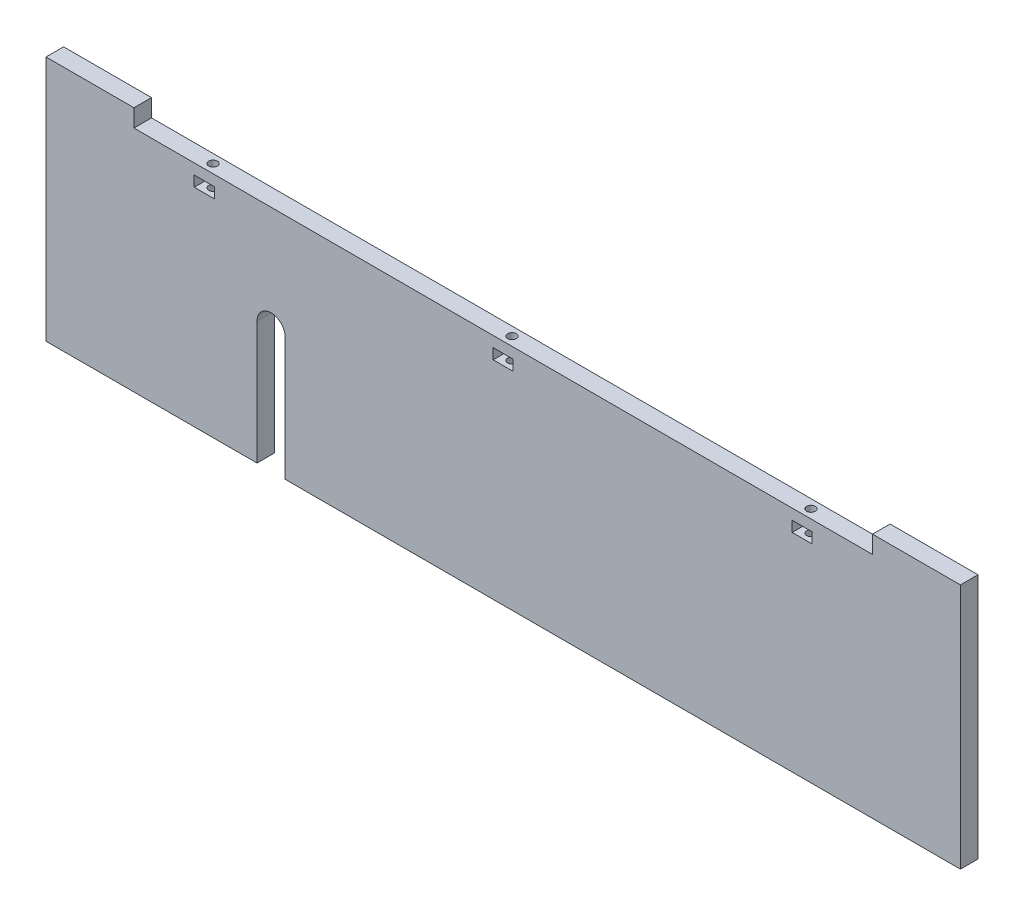
ISO-10303-21;
HEADER;
FILE_DESCRIPTION(('STEP AP214'),'2;1');
FILE_NAME('part.step','',(''),(''),'','','');
FILE_SCHEMA(('AUTOMOTIVE_DESIGN { 1 0 10303 214 1 1 1 1 }'));
ENDSEC;
DATA;
#1=APPLICATION_CONTEXT('core data for automotive mechanical design processes');
#2=APPLICATION_PROTOCOL_DEFINITION('international standard','automotive_design',2000,#1);
#3=PRODUCT_CONTEXT('',#1,'mechanical');
#4=PRODUCT('Part','Part','',(#3));
#5=PRODUCT_RELATED_PRODUCT_CATEGORY('part','',(#4));
#6=PRODUCT_DEFINITION_FORMATION('','',#4);
#7=PRODUCT_DEFINITION_CONTEXT('part definition',#1,'design');
#8=PRODUCT_DEFINITION('design','',#6,#7);
#9=PRODUCT_DEFINITION_SHAPE('','',#8);
#10=(LENGTH_UNIT() NAMED_UNIT(*) SI_UNIT(.MILLI.,.METRE.));
#11=(NAMED_UNIT(*) PLANE_ANGLE_UNIT() SI_UNIT($,.RADIAN.));
#12=(NAMED_UNIT(*) SI_UNIT($,.STERADIAN.) SOLID_ANGLE_UNIT());
#13=UNCERTAINTY_MEASURE_WITH_UNIT(LENGTH_MEASURE(1.E-05),#10,'distance_accuracy_value','');
#14=(GEOMETRIC_REPRESENTATION_CONTEXT(3) GLOBAL_UNCERTAINTY_ASSIGNED_CONTEXT((#13)) GLOBAL_UNIT_ASSIGNED_CONTEXT((#10,
#11,#12)) REPRESENTATION_CONTEXT('',''));
#15=CARTESIAN_POINT('',(0.,0.,0.));
#16=DIRECTION('',(0.,0.,1.));
#17=DIRECTION('',(1.,0.,0.));
#18=AXIS2_PLACEMENT_3D('',#15,#16,#17);
#19=CARTESIAN_POINT('',(54.9999999999999,1.19904086659517E-13,5.));
#20=DIRECTION('',(-1.,0.,0.));
#21=DIRECTION('',(0.,-1.,0.));
#22=AXIS2_PLACEMENT_3D('',#19,#20,#21);
#23=PLANE('',#22);
#24=DIRECTION('',(0.,-1.,0.));
#25=VECTOR('',#24,1.);
#26=CARTESIAN_POINT('',(54.9999999999998,16.9589552238804,0.));
#27=LINE('',#26,#25);
#28=CARTESIAN_POINT('',(54.9999999999996,35.0000000000001,0.));
#29=VERTEX_POINT('',#28);
#30=CARTESIAN_POINT('',(54.9999999999999,1.19904086659517E-13,0.));
#31=VERTEX_POINT('',#30);
#32=EDGE_CURVE('E182',#29,#31,#27,.T.);
#33=ORIENTED_EDGE('',*,*,#32,.F.);
#34=DIRECTION('',(0.,0.,-1.));
#35=VECTOR('',#34,1.);
#36=CARTESIAN_POINT('',(54.9999999999996,35.0000000000001,5.));
#37=LINE('',#36,#35);
#38=CARTESIAN_POINT('',(54.9999999999996,35.0000000000001,5.));
#39=VERTEX_POINT('',#38);
#40=EDGE_CURVE('E25',#39,#29,#37,.T.);
#41=ORIENTED_EDGE('',*,*,#40,.F.);
#42=DIRECTION('',(0.,1.,0.));
#43=VECTOR('',#42,1.);
#44=CARTESIAN_POINT('',(54.9999999999998,16.9589552238804,5.));
#45=LINE('',#44,#43);
#46=CARTESIAN_POINT('',(54.9999999999999,1.19904086659517E-13,5.));
#47=VERTEX_POINT('',#46);
#48=EDGE_CURVE('E210',#47,#39,#45,.T.);
#49=ORIENTED_EDGE('',*,*,#48,.F.);
#50=DIRECTION('',(0.,0.,1.));
#51=VECTOR('',#50,1.);
#52=CARTESIAN_POINT('',(54.9999999999999,1.06759475858222E-13,2.5));
#53=LINE('',#52,#51);
#54=EDGE_CURVE('E186',#31,#47,#53,.T.);
#55=ORIENTED_EDGE('',*,*,#54,.F.);
#56=EDGE_LOOP('',(#33,#41,#49,#55));
#57=FACE_BOUND('',#56,.T.);
#58=ADVANCED_FACE('F16',(#57),#23,.F.);
#59=CARTESIAN_POINT('',(62.9999999999996,34.9999999999996,5.));
#60=DIRECTION('',(1.,0.,0.));
#61=DIRECTION('',(0.,1.,0.));
#62=AXIS2_PLACEMENT_3D('',#59,#60,#61);
#63=PLANE('',#62);
#64=DIRECTION('',(0.,1.,0.));
#65=VECTOR('',#64,1.);
#66=CARTESIAN_POINT('',(62.9999999999996,34.4589552238802,0.));
#67=LINE('',#66,#65);
#68=CARTESIAN_POINT('',(62.9999999999999,1.29368869832E-13,0.));
#69=VERTEX_POINT('',#68);
#70=CARTESIAN_POINT('',(62.9999999999996,34.9999999999996,0.));
#71=VERTEX_POINT('',#70);
#72=EDGE_CURVE('E203',#69,#71,#67,.T.);
#73=ORIENTED_EDGE('',*,*,#72,.F.);
#74=DIRECTION('',(0.,0.,-1.));
#75=VECTOR('',#74,1.);
#76=CARTESIAN_POINT('',(62.9999999999999,1.17683640610267E-13,2.5));
#77=LINE('',#76,#75);
#78=CARTESIAN_POINT('',(62.9999999999999,1.29368869832E-13,5.));
#79=VERTEX_POINT('',#78);
#80=EDGE_CURVE('E223',#79,#69,#77,.T.);
#81=ORIENTED_EDGE('',*,*,#80,.F.);
#82=DIRECTION('',(0.,-1.,0.));
#83=VECTOR('',#82,1.);
#84=CARTESIAN_POINT('',(62.9999999999996,34.4589552238802,5.));
#85=LINE('',#84,#83);
#86=CARTESIAN_POINT('',(62.9999999999996,34.9999999999996,5.));
#87=VERTEX_POINT('',#86);
#88=EDGE_CURVE('E231',#87,#79,#85,.T.);
#89=ORIENTED_EDGE('',*,*,#88,.F.);
#90=DIRECTION('',(0.,0.,-1.));
#91=VECTOR('',#90,1.);
#92=CARTESIAN_POINT('',(62.9999999999996,34.9999999999996,5.));
#93=LINE('',#92,#91);
#94=EDGE_CURVE('E11',#87,#71,#93,.T.);
#95=ORIENTED_EDGE('',*,*,#94,.T.);
#96=EDGE_LOOP('',(#73,#81,#89,#95));
#97=FACE_BOUND('',#96,.T.);
#98=ADVANCED_FACE('F456',(#97),#63,.F.);
#99=CARTESIAN_POINT('',(58.9999999999996,34.9999999999996,5.));
#100=DIRECTION('',(0.,0.,-1.));
#101=DIRECTION('',(0.,-1.,0.));
#102=AXIS2_PLACEMENT_3D('',#99,#100,#101);
#103=CYLINDRICAL_SURFACE('',#102,4.);
#104=CARTESIAN_POINT('',(58.9999999999996,34.9999999999996,0.));
#105=DIRECTION('',(0.,0.,1.));
#106=DIRECTION('',(1.,0.,0.));
#107=AXIS2_PLACEMENT_3D('',#104,#105,#106);
#108=CIRCLE('',#107,4.);
#109=EDGE_CURVE('E191',#71,#29,#108,.T.);
#110=ORIENTED_EDGE('',*,*,#109,.F.);
#111=ORIENTED_EDGE('',*,*,#94,.F.);
#112=CARTESIAN_POINT('',(58.9999999999996,34.9999999999996,5.));
#113=DIRECTION('',(0.,0.,-1.));
#114=DIRECTION('',(0.,-1.,0.));
#115=AXIS2_PLACEMENT_3D('',#112,#113,#114);
#116=CIRCLE('',#115,4.);
#117=EDGE_CURVE('E198',#39,#87,#116,.T.);
#118=ORIENTED_EDGE('',*,*,#117,.F.);
#119=ORIENTED_EDGE('',*,*,#40,.T.);
#120=EDGE_LOOP('',(#110,#111,#118,#119));
#121=FACE_BOUND('',#120,.T.);
#122=ADVANCED_FACE('F18',(#121),#103,.F.);
#123=CARTESIAN_POINT('',(-4.99999999999996,0.,0.));
#124=DIRECTION('',(0.,-1.,0.));
#125=DIRECTION('',(1.,0.,0.));
#126=AXIS2_PLACEMENT_3D('',#123,#124,#125);
#127=PLANE('',#126);
#128=ORIENTED_EDGE('',*,*,#54,.T.);
#129=DIRECTION('',(1.,0.,0.));
#130=VECTOR('',#129,1.);
#131=CARTESIAN_POINT('',(-4.99999999999996,0.,5.));
#132=LINE('',#131,#130);
#133=CARTESIAN_POINT('',(-4.99999999999996,0.,5.));
#134=VERTEX_POINT('',#133);
#135=EDGE_CURVE('E212',#134,#47,#132,.T.);
#136=ORIENTED_EDGE('',*,*,#135,.F.);
#137=DIRECTION('',(0.,0.,1.));
#138=VECTOR('',#137,1.);
#139=CARTESIAN_POINT('',(-4.99999999999996,0.,0.));
#140=LINE('',#139,#138);
#141=CARTESIAN_POINT('',(-4.99999999999996,0.,0.));
#142=VERTEX_POINT('',#141);
#143=EDGE_CURVE('E216',#142,#134,#140,.T.);
#144=ORIENTED_EDGE('',*,*,#143,.F.);
#145=DIRECTION('',(1.,0.,0.));
#146=VECTOR('',#145,1.);
#147=CARTESIAN_POINT('',(-4.99999999999996,0.,0.));
#148=LINE('',#147,#146);
#149=EDGE_CURVE('E221',#142,#31,#148,.T.);
#150=ORIENTED_EDGE('',*,*,#149,.T.);
#151=EDGE_LOOP('',(#128,#136,#144,#150));
#152=FACE_BOUND('',#151,.T.);
#153=ADVANCED_FACE('F426',(#152),#127,.T.);
#154=CARTESIAN_POINT('',(-4.99999999999996,0.,0.));
#155=DIRECTION('',(0.,-1.,0.));
#156=DIRECTION('',(1.,0.,0.));
#157=AXIS2_PLACEMENT_3D('',#154,#155,#156);
#158=PLANE('',#157);
#159=ORIENTED_EDGE('',*,*,#80,.T.);
#160=DIRECTION('',(1.,0.,0.));
#161=VECTOR('',#160,1.);
#162=CARTESIAN_POINT('',(-4.99999999999996,0.,0.));
#163=LINE('',#162,#161);
#164=CARTESIAN_POINT('',(255.,3.72541736806596E-13,0.));
#165=VERTEX_POINT('',#164);
#166=EDGE_CURVE('E224',#69,#165,#163,.T.);
#167=ORIENTED_EDGE('',*,*,#166,.T.);
#168=DIRECTION('',(0.,0.,1.));
#169=VECTOR('',#168,1.);
#170=CARTESIAN_POINT('',(255.,3.72541736806596E-13,0.));
#171=LINE('',#170,#169);
#172=CARTESIAN_POINT('',(255.,3.72541736806596E-13,5.));
#173=VERTEX_POINT('',#172);
#174=EDGE_CURVE('E205',#165,#173,#171,.T.);
#175=ORIENTED_EDGE('',*,*,#174,.T.);
#176=DIRECTION('',(1.,0.,0.));
#177=VECTOR('',#176,1.);
#178=CARTESIAN_POINT('',(-4.99999999999996,0.,5.));
#179=LINE('',#178,#177);
#180=EDGE_CURVE('E229',#79,#173,#179,.T.);
#181=ORIENTED_EDGE('',*,*,#180,.F.);
#182=EDGE_LOOP('',(#159,#167,#175,#181));
#183=FACE_BOUND('',#182,.T.);
#184=ADVANCED_FACE('F454',(#183),#158,.T.);
#185=CARTESIAN_POINT('',(125.,33.9179104477613,0.));
#186=DIRECTION('',(0.,0.,1.));
#187=DIRECTION('',(0.,-1.,0.));
#188=AXIS2_PLACEMENT_3D('',#185,#186,#187);
#189=PLANE('',#188);
#190=ORIENTED_EDGE('',*,*,#72,.T.);
#191=ORIENTED_EDGE('',*,*,#109,.T.);
#192=ORIENTED_EDGE('',*,*,#32,.T.);
#193=ORIENTED_EDGE('',*,*,#149,.F.);
#194=DIRECTION('',(0.,-1.,0.));
#195=VECTOR('',#194,1.);
#196=CARTESIAN_POINT('',(-5.00000000000005,69.9999999999997,0.));
#197=LINE('',#196,#195);
#198=CARTESIAN_POINT('',(-5.00000000000005,69.9999999999997,0.));
#199=VERTEX_POINT('',#198);
#200=EDGE_CURVE('E219',#199,#142,#197,.T.);
#201=ORIENTED_EDGE('',*,*,#200,.F.);
#202=DIRECTION('',(-1.,0.,0.));
#203=VECTOR('',#202,1.);
#204=CARTESIAN_POINT('',(20.,69.9999999999997,0.));
#205=LINE('',#204,#203);
#206=CARTESIAN_POINT('',(20.,69.9999999999997,0.));
#207=VERTEX_POINT('',#206);
#208=EDGE_CURVE('E220',#207,#199,#205,.T.);
#209=ORIENTED_EDGE('',*,*,#208,.F.);
#210=DIRECTION('',(0.,1.,0.));
#211=VECTOR('',#210,1.);
#212=CARTESIAN_POINT('',(20.,64.9999999999998,0.));
#213=LINE('',#212,#211);
#214=CARTESIAN_POINT('',(20.,64.9999999999998,0.));
#215=VERTEX_POINT('',#214);
#216=EDGE_CURVE('E237',#215,#207,#213,.T.);
#217=ORIENTED_EDGE('',*,*,#216,.F.);
#218=DIRECTION('',(-1.,0.,0.));
#219=VECTOR('',#218,1.);
#220=CARTESIAN_POINT('',(230.,65.0000000000001,0.));
#221=LINE('',#220,#219);
#222=CARTESIAN_POINT('',(230.,65.0000000000001,0.));
#223=VERTEX_POINT('',#222);
#224=EDGE_CURVE('E240',#223,#215,#221,.T.);
#225=ORIENTED_EDGE('',*,*,#224,.F.);
#226=DIRECTION('',(0.,-1.,0.));
#227=VECTOR('',#226,1.);
#228=CARTESIAN_POINT('',(230.,70.0000000000001,0.));
#229=LINE('',#228,#227);
#230=CARTESIAN_POINT('',(230.,70.0000000000001,0.));
#231=VERTEX_POINT('',#230);
#232=EDGE_CURVE('E244',#231,#223,#229,.T.);
#233=ORIENTED_EDGE('',*,*,#232,.F.);
#234=DIRECTION('',(-1.,0.,0.));
#235=VECTOR('',#234,1.);
#236=CARTESIAN_POINT('',(255.,70.0000000000002,0.));
#237=LINE('',#236,#235);
#238=CARTESIAN_POINT('',(255.,70.0000000000002,0.));
#239=VERTEX_POINT('',#238);
#240=EDGE_CURVE('E247',#239,#231,#237,.T.);
#241=ORIENTED_EDGE('',*,*,#240,.F.);
#242=DIRECTION('',(0.,1.,0.));
#243=VECTOR('',#242,1.);
#244=CARTESIAN_POINT('',(255.,3.72541736806596E-13,0.));
#245=LINE('',#244,#243);
#246=EDGE_CURVE('E250',#165,#239,#245,.T.);
#247=ORIENTED_EDGE('',*,*,#246,.F.);
#248=ORIENTED_EDGE('',*,*,#166,.F.);
#249=EDGE_LOOP('',(#190,#191,#192,#193,#201,#209,#217,#225,#233,#241,#247,#248));
#250=FACE_BOUND('',#249,.T.);
#251=DIRECTION('',(0.,-1.,0.));
#252=VECTOR('',#251,1.);
#253=CARTESIAN_POINT('',(207.15,46.4589552238807,0.));
#254=LINE('',#253,#252);
#255=CARTESIAN_POINT('',(207.15,62.0000000000001,0.));
#256=VERTEX_POINT('',#255);
#257=CARTESIAN_POINT('',(207.15,59.0000000000001,0.));
#258=VERTEX_POINT('',#257);
#259=EDGE_CURVE('E192',#256,#258,#254,.T.);
#260=ORIENTED_EDGE('',*,*,#259,.T.);
#261=DIRECTION('',(1.,0.,0.));
#262=VECTOR('',#261,1.);
#263=CARTESIAN_POINT('',(168.925,59.,0.));
#264=LINE('',#263,#262);
#265=CARTESIAN_POINT('',(212.85,59.0000000000001,0.));
#266=VERTEX_POINT('',#265);
#267=EDGE_CURVE('E255',#258,#266,#264,.T.);
#268=ORIENTED_EDGE('',*,*,#267,.T.);
#269=DIRECTION('',(0.,1.,0.));
#270=VECTOR('',#269,1.);
#271=CARTESIAN_POINT('',(212.85,47.9589552238807,0.));
#272=LINE('',#271,#270);
#273=CARTESIAN_POINT('',(212.85,62.0000000000001,0.));
#274=VERTEX_POINT('',#273);
#275=EDGE_CURVE('E258',#266,#274,#272,.T.);
#276=ORIENTED_EDGE('',*,*,#275,.T.);
#277=DIRECTION('',(-1.,0.,0.));
#278=VECTOR('',#277,1.);
#279=CARTESIAN_POINT('',(166.075,62.,0.));
#280=LINE('',#279,#278);
#281=EDGE_CURVE('E261',#274,#256,#280,.T.);
#282=ORIENTED_EDGE('',*,*,#281,.T.);
#283=EDGE_LOOP('',(#260,#268,#276,#282));
#284=FACE_BOUND('',#283,.T.);
#285=DIRECTION('',(0.,-1.,0.));
#286=VECTOR('',#285,1.);
#287=CARTESIAN_POINT('',(37.15,46.4589552238805,0.));
#288=LINE('',#287,#286);
#289=CARTESIAN_POINT('',(37.15,61.9999999999998,0.));
#290=VERTEX_POINT('',#289);
#291=CARTESIAN_POINT('',(37.15,58.9999999999998,0.));
#292=VERTEX_POINT('',#291);
#293=EDGE_CURVE('E263',#290,#292,#288,.T.);
#294=ORIENTED_EDGE('',*,*,#293,.T.);
#295=DIRECTION('',(1.,0.,0.));
#296=VECTOR('',#295,1.);
#297=CARTESIAN_POINT('',(83.925,58.9999999999999,0.));
#298=LINE('',#297,#296);
#299=CARTESIAN_POINT('',(42.85,58.9999999999998,0.));
#300=VERTEX_POINT('',#299);
#301=EDGE_CURVE('E266',#292,#300,#298,.T.);
#302=ORIENTED_EDGE('',*,*,#301,.T.);
#303=DIRECTION('',(0.,1.,0.));
#304=VECTOR('',#303,1.);
#305=CARTESIAN_POINT('',(42.85,47.9589552238805,0.));
#306=LINE('',#305,#304);
#307=CARTESIAN_POINT('',(42.85,61.9999999999998,0.));
#308=VERTEX_POINT('',#307);
#309=EDGE_CURVE('E269',#300,#308,#306,.T.);
#310=ORIENTED_EDGE('',*,*,#309,.T.);
#311=DIRECTION('',(-1.,0.,0.));
#312=VECTOR('',#311,1.);
#313=CARTESIAN_POINT('',(81.075,61.9999999999998,0.));
#314=LINE('',#313,#312);
#315=EDGE_CURVE('E272',#308,#290,#314,.T.);
#316=ORIENTED_EDGE('',*,*,#315,.T.);
#317=EDGE_LOOP('',(#294,#302,#310,#316));
#318=FACE_BOUND('',#317,.T.);
#319=DIRECTION('',(-1.,0.,0.));
#320=VECTOR('',#319,1.);
#321=CARTESIAN_POINT('',(123.575,61.9999999999999,0.));
#322=LINE('',#321,#320);
#323=CARTESIAN_POINT('',(127.85,61.9999999999999,0.));
#324=VERTEX_POINT('',#323);
#325=CARTESIAN_POINT('',(122.15,61.9999999999999,0.));
#326=VERTEX_POINT('',#325);
#327=EDGE_CURVE('E274',#324,#326,#322,.T.);
#328=ORIENTED_EDGE('',*,*,#327,.T.);
#329=DIRECTION('',(0.,-1.,0.));
#330=VECTOR('',#329,1.);
#331=CARTESIAN_POINT('',(122.15,46.4589552238806,0.));
#332=LINE('',#331,#330);
#333=CARTESIAN_POINT('',(122.15,59.,0.));
#334=VERTEX_POINT('',#333);
#335=EDGE_CURVE('E277',#326,#334,#332,.T.);
#336=ORIENTED_EDGE('',*,*,#335,.T.);
#337=DIRECTION('',(1.,0.,0.));
#338=VECTOR('',#337,1.);
#339=CARTESIAN_POINT('',(126.425,59.,0.));
#340=LINE('',#339,#338);
#341=CARTESIAN_POINT('',(127.85,59.,0.));
#342=VERTEX_POINT('',#341);
#343=EDGE_CURVE('E280',#334,#342,#340,.T.);
#344=ORIENTED_EDGE('',*,*,#343,.T.);
#345=DIRECTION('',(0.,1.,0.));
#346=VECTOR('',#345,1.);
#347=CARTESIAN_POINT('',(127.85,47.9589552238806,0.));
#348=LINE('',#347,#346);
#349=EDGE_CURVE('E283',#342,#324,#348,.T.);
#350=ORIENTED_EDGE('',*,*,#349,.T.);
#351=EDGE_LOOP('',(#328,#336,#344,#350));
#352=FACE_BOUND('',#351,.T.);
#353=ADVANCED_FACE('F200',(#250,#284,#318,#352),#189,.F.);
#354=CARTESIAN_POINT('',(127.85,61.9999999999999,5.));
#355=DIRECTION('',(1.,0.,0.));
#356=DIRECTION('',(0.,1.,0.));
#357=AXIS2_PLACEMENT_3D('',#354,#355,#356);
#358=PLANE('',#357);
#359=ORIENTED_EDGE('',*,*,#349,.F.);
#360=DIRECTION('',(0.,0.,-1.));
#361=VECTOR('',#360,1.);
#362=CARTESIAN_POINT('',(127.85,59.,5.));
#363=LINE('',#362,#361);
#364=CARTESIAN_POINT('',(127.85,59.,5.));
#365=VERTEX_POINT('',#364);
#366=EDGE_CURVE('E286',#365,#342,#363,.T.);
#367=ORIENTED_EDGE('',*,*,#366,.F.);
#368=DIRECTION('',(0.,-1.,0.));
#369=VECTOR('',#368,1.);
#370=CARTESIAN_POINT('',(127.85,47.9589552238806,5.));
#371=LINE('',#370,#369);
#372=CARTESIAN_POINT('',(127.85,61.9999999999999,5.));
#373=VERTEX_POINT('',#372);
#374=EDGE_CURVE('E290',#373,#365,#371,.T.);
#375=ORIENTED_EDGE('',*,*,#374,.F.);
#376=DIRECTION('',(0.,0.,-1.));
#377=VECTOR('',#376,1.);
#378=CARTESIAN_POINT('',(127.85,61.9999999999999,5.));
#379=LINE('',#378,#377);
#380=EDGE_CURVE('E285',#373,#324,#379,.T.);
#381=ORIENTED_EDGE('',*,*,#380,.T.);
#382=EDGE_LOOP('',(#359,#367,#375,#381));
#383=FACE_BOUND('',#382,.T.);
#384=ADVANCED_FACE('F472',(#383),#358,.F.);
#385=CARTESIAN_POINT('',(127.85,59.,5.));
#386=DIRECTION('',(0.,-1.,0.));
#387=DIRECTION('',(1.,0.,0.));
#388=AXIS2_PLACEMENT_3D('',#385,#386,#387);
#389=PLANE('',#388);
#390=ORIENTED_EDGE('',*,*,#343,.F.);
#391=DIRECTION('',(0.,0.,-1.));
#392=VECTOR('',#391,1.);
#393=CARTESIAN_POINT('',(122.15,59.,5.));
#394=LINE('',#393,#392);
#395=CARTESIAN_POINT('',(122.15,59.,5.));
#396=VERTEX_POINT('',#395);
#397=EDGE_CURVE('E295',#396,#334,#394,.T.);
#398=ORIENTED_EDGE('',*,*,#397,.F.);
#399=DIRECTION('',(-1.,0.,0.));
#400=VECTOR('',#399,1.);
#401=CARTESIAN_POINT('',(126.425,59.,5.));
#402=LINE('',#401,#400);
#403=EDGE_CURVE('E292',#365,#396,#402,.T.);
#404=ORIENTED_EDGE('',*,*,#403,.F.);
#405=ORIENTED_EDGE('',*,*,#366,.T.);
#406=EDGE_LOOP('',(#390,#398,#404,#405));
#407=FACE_BOUND('',#406,.T.);
#408=CARTESIAN_POINT('',(125.,58.9999999999999,2.5));
#409=DIRECTION('',(0.,1.,0.));
#410=DIRECTION('',(1.,0.,0.));
#411=AXIS2_PLACEMENT_3D('',#408,#409,#410);
#412=CIRCLE('',#411,1.2295);
#413=CARTESIAN_POINT('',(126.2295,58.9999999999999,2.5));
#414=VERTEX_POINT('',#413);
#415=EDGE_CURVE('E301',#414,#414,#412,.T.);
#416=ORIENTED_EDGE('',*,*,#415,.F.);
#417=EDGE_LOOP('',(#416));
#418=FACE_BOUND('',#417,.T.);
#419=ADVANCED_FACE('F475',(#407,#418),#389,.F.);
#420=CARTESIAN_POINT('',(122.15,61.9999999999999,5.));
#421=DIRECTION('',(0.,1.,0.));
#422=DIRECTION('',(-1.,0.,0.));
#423=AXIS2_PLACEMENT_3D('',#420,#421,#422);
#424=PLANE('',#423);
#425=ORIENTED_EDGE('',*,*,#327,.F.);
#426=ORIENTED_EDGE('',*,*,#380,.F.);
#427=DIRECTION('',(1.,0.,0.));
#428=VECTOR('',#427,1.);
#429=CARTESIAN_POINT('',(123.575,61.9999999999999,5.));
#430=LINE('',#429,#428);
#431=CARTESIAN_POINT('',(122.15,61.9999999999999,5.));
#432=VERTEX_POINT('',#431);
#433=EDGE_CURVE('E211',#432,#373,#430,.T.);
#434=ORIENTED_EDGE('',*,*,#433,.F.);
#435=DIRECTION('',(0.,0.,-1.));
#436=VECTOR('',#435,1.);
#437=CARTESIAN_POINT('',(122.15,61.9999999999999,5.));
#438=LINE('',#437,#436);
#439=EDGE_CURVE('E289',#432,#326,#438,.T.);
#440=ORIENTED_EDGE('',*,*,#439,.T.);
#441=EDGE_LOOP('',(#425,#426,#434,#440));
#442=FACE_BOUND('',#441,.T.);
#443=CARTESIAN_POINT('',(125.,62.,2.5));
#444=DIRECTION('',(0.,-1.,0.));
#445=DIRECTION('',(0.,0.,-1.));
#446=AXIS2_PLACEMENT_3D('',#443,#444,#445);
#447=CIRCLE('',#446,1.2295);
#448=CARTESIAN_POINT('',(125.,62.,1.2705));
#449=VERTEX_POINT('',#448);
#450=EDGE_CURVE('E310',#449,#449,#447,.T.);
#451=ORIENTED_EDGE('',*,*,#450,.F.);
#452=EDGE_LOOP('',(#451));
#453=FACE_BOUND('',#452,.T.);
#454=ADVANCED_FACE('F479',(#442,#453),#424,.F.);
#455=CARTESIAN_POINT('',(122.15,59.,5.));
#456=DIRECTION('',(-1.,0.,0.));
#457=DIRECTION('',(0.,-1.,0.));
#458=AXIS2_PLACEMENT_3D('',#455,#456,#457);
#459=PLANE('',#458);
#460=ORIENTED_EDGE('',*,*,#335,.F.);
#461=ORIENTED_EDGE('',*,*,#439,.F.);
#462=DIRECTION('',(0.,1.,0.));
#463=VECTOR('',#462,1.);
#464=CARTESIAN_POINT('',(122.15,46.4589552238806,5.));
#465=LINE('',#464,#463);
#466=EDGE_CURVE('E300',#396,#432,#465,.T.);
#467=ORIENTED_EDGE('',*,*,#466,.F.);
#468=ORIENTED_EDGE('',*,*,#397,.T.);
#469=EDGE_LOOP('',(#460,#461,#467,#468));
#470=FACE_BOUND('',#469,.T.);
#471=ADVANCED_FACE('F483',(#470),#459,.F.);
#472=CARTESIAN_POINT('',(42.85,61.9999999999998,5.));
#473=DIRECTION('',(1.,0.,0.));
#474=DIRECTION('',(0.,1.,0.));
#475=AXIS2_PLACEMENT_3D('',#472,#473,#474);
#476=PLANE('',#475);
#477=ORIENTED_EDGE('',*,*,#309,.F.);
#478=DIRECTION('',(0.,0.,-1.));
#479=VECTOR('',#478,1.);
#480=CARTESIAN_POINT('',(42.85,58.9999999999998,5.));
#481=LINE('',#480,#479);
#482=CARTESIAN_POINT('',(42.85,58.9999999999998,5.));
#483=VERTEX_POINT('',#482);
#484=EDGE_CURVE('E318',#483,#300,#481,.T.);
#485=ORIENTED_EDGE('',*,*,#484,.F.);
#486=DIRECTION('',(0.,-1.,0.));
#487=VECTOR('',#486,1.);
#488=CARTESIAN_POINT('',(42.85,47.9589552238805,5.));
#489=LINE('',#488,#487);
#490=CARTESIAN_POINT('',(42.85,61.9999999999998,5.));
#491=VERTEX_POINT('',#490);
#492=EDGE_CURVE('E323',#491,#483,#489,.T.);
#493=ORIENTED_EDGE('',*,*,#492,.F.);
#494=DIRECTION('',(0.,0.,-1.));
#495=VECTOR('',#494,1.);
#496=CARTESIAN_POINT('',(42.85,61.9999999999998,5.));
#497=LINE('',#496,#495);
#498=EDGE_CURVE('E298',#491,#308,#497,.T.);
#499=ORIENTED_EDGE('',*,*,#498,.T.);
#500=EDGE_LOOP('',(#477,#485,#493,#499));
#501=FACE_BOUND('',#500,.T.);
#502=ADVANCED_FACE('F487',(#501),#476,.F.);
#503=CARTESIAN_POINT('',(37.15,61.9999999999998,5.));
#504=DIRECTION('',(0.,1.,0.));
#505=DIRECTION('',(-1.,0.,0.));
#506=AXIS2_PLACEMENT_3D('',#503,#504,#505);
#507=PLANE('',#506);
#508=ORIENTED_EDGE('',*,*,#315,.F.);
#509=ORIENTED_EDGE('',*,*,#498,.F.);
#510=DIRECTION('',(1.,0.,0.));
#511=VECTOR('',#510,1.);
#512=CARTESIAN_POINT('',(81.075,61.9999999999998,5.));
#513=LINE('',#512,#511);
#514=CARTESIAN_POINT('',(37.15,61.9999999999998,5.));
#515=VERTEX_POINT('',#514);
#516=EDGE_CURVE('E325',#515,#491,#513,.T.);
#517=ORIENTED_EDGE('',*,*,#516,.F.);
#518=DIRECTION('',(0.,0.,-1.));
#519=VECTOR('',#518,1.);
#520=CARTESIAN_POINT('',(37.15,61.9999999999998,5.));
#521=LINE('',#520,#519);
#522=EDGE_CURVE('E329',#515,#290,#521,.T.);
#523=ORIENTED_EDGE('',*,*,#522,.T.);
#524=EDGE_LOOP('',(#508,#509,#517,#523));
#525=FACE_BOUND('',#524,.T.);
#526=CARTESIAN_POINT('',(40.,61.9999999999998,2.5));
#527=DIRECTION('',(0.,-1.,0.));
#528=DIRECTION('',(0.,0.,-1.));
#529=AXIS2_PLACEMENT_3D('',#526,#527,#528);
#530=CIRCLE('',#529,1.2295);
#531=CARTESIAN_POINT('',(40.,61.9999999999998,1.2705));
#532=VERTEX_POINT('',#531);
#533=EDGE_CURVE('E305',#532,#532,#530,.T.);
#534=ORIENTED_EDGE('',*,*,#533,.F.);
#535=EDGE_LOOP('',(#534));
#536=FACE_BOUND('',#535,.T.);
#537=ADVANCED_FACE('F491',(#525,#536),#507,.F.);
#538=CARTESIAN_POINT('',(37.15,58.9999999999998,5.));
#539=DIRECTION('',(-1.,0.,0.));
#540=DIRECTION('',(0.,-1.,0.));
#541=AXIS2_PLACEMENT_3D('',#538,#539,#540);
#542=PLANE('',#541);
#543=ORIENTED_EDGE('',*,*,#293,.F.);
#544=ORIENTED_EDGE('',*,*,#522,.F.);
#545=DIRECTION('',(0.,1.,0.));
#546=VECTOR('',#545,1.);
#547=CARTESIAN_POINT('',(37.15,46.4589552238805,5.));
#548=LINE('',#547,#546);
#549=CARTESIAN_POINT('',(37.15,58.9999999999998,5.));
#550=VERTEX_POINT('',#549);
#551=EDGE_CURVE('E317',#550,#515,#548,.T.);
#552=ORIENTED_EDGE('',*,*,#551,.F.);
#553=DIRECTION('',(0.,0.,-1.));
#554=VECTOR('',#553,1.);
#555=CARTESIAN_POINT('',(37.15,58.9999999999998,5.));
#556=LINE('',#555,#554);
#557=EDGE_CURVE('E321',#550,#292,#556,.T.);
#558=ORIENTED_EDGE('',*,*,#557,.T.);
#559=EDGE_LOOP('',(#543,#544,#552,#558));
#560=FACE_BOUND('',#559,.T.);
#561=ADVANCED_FACE('F495',(#560),#542,.F.);
#562=CARTESIAN_POINT('',(42.85,58.9999999999998,5.));
#563=DIRECTION('',(0.,-1.,0.));
#564=DIRECTION('',(1.,0.,0.));
#565=AXIS2_PLACEMENT_3D('',#562,#563,#564);
#566=PLANE('',#565);
#567=ORIENTED_EDGE('',*,*,#301,.F.);
#568=ORIENTED_EDGE('',*,*,#557,.F.);
#569=DIRECTION('',(-1.,0.,0.));
#570=VECTOR('',#569,1.);
#571=CARTESIAN_POINT('',(83.925,58.9999999999999,5.));
#572=LINE('',#571,#570);
#573=EDGE_CURVE('E326',#483,#550,#572,.T.);
#574=ORIENTED_EDGE('',*,*,#573,.F.);
#575=ORIENTED_EDGE('',*,*,#484,.T.);
#576=EDGE_LOOP('',(#567,#568,#574,#575));
#577=FACE_BOUND('',#576,.T.);
#578=CARTESIAN_POINT('',(40.,58.9999999999998,2.5));
#579=DIRECTION('',(0.,1.,0.));
#580=DIRECTION('',(1.,0.,0.));
#581=AXIS2_PLACEMENT_3D('',#578,#579,#580);
#582=CIRCLE('',#581,1.2295);
#583=CARTESIAN_POINT('',(41.2295,58.9999999999998,2.5));
#584=VERTEX_POINT('',#583);
#585=EDGE_CURVE('E344',#584,#584,#582,.T.);
#586=ORIENTED_EDGE('',*,*,#585,.F.);
#587=EDGE_LOOP('',(#586));
#588=FACE_BOUND('',#587,.T.);
#589=ADVANCED_FACE('F499',(#577,#588),#566,.F.);
#590=CARTESIAN_POINT('',(212.85,62.0000000000001,5.));
#591=DIRECTION('',(1.,0.,0.));
#592=DIRECTION('',(0.,1.,0.));
#593=AXIS2_PLACEMENT_3D('',#590,#591,#592);
#594=PLANE('',#593);
#595=ORIENTED_EDGE('',*,*,#275,.F.);
#596=DIRECTION('',(0.,0.,-1.));
#597=VECTOR('',#596,1.);
#598=CARTESIAN_POINT('',(212.85,59.0000000000001,5.));
#599=LINE('',#598,#597);
#600=CARTESIAN_POINT('',(212.85,59.0000000000001,5.));
#601=VERTEX_POINT('',#600);
#602=EDGE_CURVE('E304',#601,#266,#599,.T.);
#603=ORIENTED_EDGE('',*,*,#602,.F.);
#604=DIRECTION('',(0.,-1.,0.));
#605=VECTOR('',#604,1.);
#606=CARTESIAN_POINT('',(212.85,47.9589552238807,5.));
#607=LINE('',#606,#605);
#608=CARTESIAN_POINT('',(212.85,62.0000000000001,5.));
#609=VERTEX_POINT('',#608);
#610=EDGE_CURVE('E351',#609,#601,#607,.T.);
#611=ORIENTED_EDGE('',*,*,#610,.F.);
#612=DIRECTION('',(0.,0.,-1.));
#613=VECTOR('',#612,1.);
#614=CARTESIAN_POINT('',(212.85,62.0000000000001,5.));
#615=LINE('',#614,#613);
#616=EDGE_CURVE('E322',#609,#274,#615,.T.);
#617=ORIENTED_EDGE('',*,*,#616,.T.);
#618=EDGE_LOOP('',(#595,#603,#611,#617));
#619=FACE_BOUND('',#618,.T.);
#620=ADVANCED_FACE('F503',(#619),#594,.F.);
#621=CARTESIAN_POINT('',(207.15,62.0000000000001,5.));
#622=DIRECTION('',(0.,1.,0.));
#623=DIRECTION('',(-1.,0.,0.));
#624=AXIS2_PLACEMENT_3D('',#621,#622,#623);
#625=PLANE('',#624);
#626=ORIENTED_EDGE('',*,*,#281,.F.);
#627=ORIENTED_EDGE('',*,*,#616,.F.);
#628=DIRECTION('',(1.,0.,0.));
#629=VECTOR('',#628,1.);
#630=CARTESIAN_POINT('',(166.075,62.,5.));
#631=LINE('',#630,#629);
#632=CARTESIAN_POINT('',(207.15,62.0000000000001,5.));
#633=VERTEX_POINT('',#632);
#634=EDGE_CURVE('E353',#633,#609,#631,.T.);
#635=ORIENTED_EDGE('',*,*,#634,.F.);
#636=DIRECTION('',(0.,0.,-1.));
#637=VECTOR('',#636,1.);
#638=CARTESIAN_POINT('',(207.15,62.0000000000001,5.));
#639=LINE('',#638,#637);
#640=EDGE_CURVE('E357',#633,#256,#639,.T.);
#641=ORIENTED_EDGE('',*,*,#640,.T.);
#642=EDGE_LOOP('',(#626,#627,#635,#641));
#643=FACE_BOUND('',#642,.T.);
#644=CARTESIAN_POINT('',(210.,62.0000000000001,2.5));
#645=DIRECTION('',(0.,-1.,0.));
#646=DIRECTION('',(0.,0.,-1.));
#647=AXIS2_PLACEMENT_3D('',#644,#645,#646);
#648=CIRCLE('',#647,1.2295);
#649=CARTESIAN_POINT('',(210.,62.0000000000001,1.2705));
#650=VERTEX_POINT('',#649);
#651=EDGE_CURVE('E336',#650,#650,#648,.T.);
#652=ORIENTED_EDGE('',*,*,#651,.F.);
#653=EDGE_LOOP('',(#652));
#654=FACE_BOUND('',#653,.T.);
#655=ADVANCED_FACE('F507',(#643,#654),#625,.F.);
#656=CARTESIAN_POINT('',(207.15,59.0000000000001,5.));
#657=DIRECTION('',(-1.,0.,0.));
#658=DIRECTION('',(0.,-1.,0.));
#659=AXIS2_PLACEMENT_3D('',#656,#657,#658);
#660=PLANE('',#659);
#661=ORIENTED_EDGE('',*,*,#259,.F.);
#662=ORIENTED_EDGE('',*,*,#640,.F.);
#663=DIRECTION('',(0.,1.,0.));
#664=VECTOR('',#663,1.);
#665=CARTESIAN_POINT('',(207.15,46.4589552238807,5.));
#666=LINE('',#665,#664);
#667=CARTESIAN_POINT('',(207.15,59.0000000000001,5.));
#668=VERTEX_POINT('',#667);
#669=EDGE_CURVE('E343',#668,#633,#666,.T.);
#670=ORIENTED_EDGE('',*,*,#669,.F.);
#671=DIRECTION('',(0.,0.,-1.));
#672=VECTOR('',#671,1.);
#673=CARTESIAN_POINT('',(207.15,59.0000000000001,5.));
#674=LINE('',#673,#672);
#675=EDGE_CURVE('E350',#668,#258,#674,.T.);
#676=ORIENTED_EDGE('',*,*,#675,.T.);
#677=EDGE_LOOP('',(#661,#662,#670,#676));
#678=FACE_BOUND('',#677,.T.);
#679=ADVANCED_FACE('F511',(#678),#660,.F.);
#680=CARTESIAN_POINT('',(212.85,59.0000000000001,5.));
#681=DIRECTION('',(0.,-1.,0.));
#682=DIRECTION('',(1.,0.,0.));
#683=AXIS2_PLACEMENT_3D('',#680,#681,#682);
#684=PLANE('',#683);
#685=ORIENTED_EDGE('',*,*,#267,.F.);
#686=ORIENTED_EDGE('',*,*,#675,.F.);
#687=DIRECTION('',(-1.,0.,0.));
#688=VECTOR('',#687,1.);
#689=CARTESIAN_POINT('',(168.925,59.,5.));
#690=LINE('',#689,#688);
#691=EDGE_CURVE('E354',#601,#668,#690,.T.);
#692=ORIENTED_EDGE('',*,*,#691,.F.);
#693=ORIENTED_EDGE('',*,*,#602,.T.);
#694=EDGE_LOOP('',(#685,#686,#692,#693));
#695=FACE_BOUND('',#694,.T.);
#696=CARTESIAN_POINT('',(210.,59.0000000000001,2.5));
#697=DIRECTION('',(0.,1.,0.));
#698=DIRECTION('',(1.,0.,0.));
#699=AXIS2_PLACEMENT_3D('',#696,#697,#698);
#700=CIRCLE('',#699,1.2295);
#701=CARTESIAN_POINT('',(211.2295,59.0000000000001,2.5));
#702=VERTEX_POINT('',#701);
#703=EDGE_CURVE('E234',#702,#702,#700,.T.);
#704=ORIENTED_EDGE('',*,*,#703,.F.);
#705=EDGE_LOOP('',(#704));
#706=FACE_BOUND('',#705,.T.);
#707=ADVANCED_FACE('F515',(#695,#706),#684,.F.);
#708=CARTESIAN_POINT('',(125.,60.5999999999999,2.5));
#709=DIRECTION('',(0.,1.,0.));
#710=DIRECTION('',(1.,0.,0.));
#711=AXIS2_PLACEMENT_3D('',#708,#709,#710);
#712=CYLINDRICAL_SURFACE('',#711,1.2295);
#713=CARTESIAN_POINT('',(125.,56.1999999999999,2.5));
#714=DIRECTION('',(0.,1.,0.));
#715=DIRECTION('',(1.,0.,0.));
#716=AXIS2_PLACEMENT_3D('',#713,#714,#715);
#717=CIRCLE('',#716,1.2295);
#718=CARTESIAN_POINT('',(126.2295,56.1999999999999,2.5));
#719=VERTEX_POINT('',#718);
#720=EDGE_CURVE('E313',#719,#719,#717,.T.);
#721=ORIENTED_EDGE('',*,*,#720,.F.);
#722=EDGE_LOOP('',(#721));
#723=FACE_BOUND('',#722,.T.);
#724=ORIENTED_EDGE('',*,*,#415,.T.);
#725=EDGE_LOOP('',(#724));
#726=FACE_BOUND('',#725,.T.);
#727=ADVANCED_FACE('F519',(#723,#726),#712,.F.);
#728=CARTESIAN_POINT('',(40.,60.5999999999998,2.5));
#729=DIRECTION('',(0.,1.,0.));
#730=DIRECTION('',(1.,0.,0.));
#731=AXIS2_PLACEMENT_3D('',#728,#729,#730);
#732=CYLINDRICAL_SURFACE('',#731,1.2295);
#733=CARTESIAN_POINT('',(40.,64.9999999999998,2.5));
#734=DIRECTION('',(0.,-1.,0.));
#735=DIRECTION('',(0.,0.,-1.));
#736=AXIS2_PLACEMENT_3D('',#733,#734,#735);
#737=CIRCLE('',#736,1.2295);
#738=CARTESIAN_POINT('',(40.,64.9999999999998,1.2705));
#739=VERTEX_POINT('',#738);
#740=EDGE_CURVE('E374',#739,#739,#737,.T.);
#741=ORIENTED_EDGE('',*,*,#740,.F.);
#742=EDGE_LOOP('',(#741));
#743=FACE_BOUND('',#742,.T.);
#744=ORIENTED_EDGE('',*,*,#533,.T.);
#745=EDGE_LOOP('',(#744));
#746=FACE_BOUND('',#745,.T.);
#747=ADVANCED_FACE('F523',(#743,#746),#732,.F.);
#748=CARTESIAN_POINT('',(210.,60.6000000000001,2.5));
#749=DIRECTION('',(0.,1.,0.));
#750=DIRECTION('',(1.,0.,0.));
#751=AXIS2_PLACEMENT_3D('',#748,#749,#750);
#752=CYLINDRICAL_SURFACE('',#751,1.2295);
#753=CARTESIAN_POINT('',(210.,65.0000000000001,2.5));
#754=DIRECTION('',(0.,-1.,0.));
#755=DIRECTION('',(0.,0.,-1.));
#756=AXIS2_PLACEMENT_3D('',#753,#754,#755);
#757=CIRCLE('',#756,1.2295);
#758=CARTESIAN_POINT('',(210.,65.0000000000001,1.2705));
#759=VERTEX_POINT('',#758);
#760=EDGE_CURVE('E242',#759,#759,#757,.T.);
#761=ORIENTED_EDGE('',*,*,#760,.F.);
#762=EDGE_LOOP('',(#761));
#763=FACE_BOUND('',#762,.T.);
#764=ORIENTED_EDGE('',*,*,#651,.T.);
#765=EDGE_LOOP('',(#764));
#766=FACE_BOUND('',#765,.T.);
#767=ADVANCED_FACE('F527',(#763,#766),#752,.F.);
#768=CARTESIAN_POINT('',(40.,55.8306209344526,2.5));
#769=DIRECTION('',(0.,1.,0.));
#770=DIRECTION('',(1.,0.,0.));
#771=AXIS2_PLACEMENT_3D('',#768,#769,#770);
#772=CONICAL_SURFACE('',#771,0.61475,1.02974425867665);
#773=CARTESIAN_POINT('',(40.,55.4612418689054,2.5));
#774=VERTEX_POINT('',#773);
#775=VERTEX_LOOP('',#774);
#776=FACE_BOUND('',#775,.T.);
#777=CARTESIAN_POINT('',(40.,56.1999999999998,2.5));
#778=DIRECTION('',(0.,1.,0.));
#779=DIRECTION('',(1.,0.,0.));
#780=AXIS2_PLACEMENT_3D('',#777,#778,#779);
#781=CIRCLE('',#780,1.2295);
#782=CARTESIAN_POINT('',(41.2295,56.1999999999998,2.5));
#783=VERTEX_POINT('',#782);
#784=EDGE_CURVE('E347',#783,#783,#781,.T.);
#785=ORIENTED_EDGE('',*,*,#784,.T.);
#786=EDGE_LOOP('',(#785));
#787=FACE_BOUND('',#786,.T.);
#788=ADVANCED_FACE('F531',(#776,#787),#772,.F.);
#789=CARTESIAN_POINT('',(40.,60.5999999999998,2.5));
#790=DIRECTION('',(0.,1.,0.));
#791=DIRECTION('',(1.,0.,0.));
#792=AXIS2_PLACEMENT_3D('',#789,#790,#791);
#793=CYLINDRICAL_SURFACE('',#792,1.2295);
#794=ORIENTED_EDGE('',*,*,#585,.T.);
#795=EDGE_LOOP('',(#794));
#796=FACE_BOUND('',#795,.T.);
#797=ORIENTED_EDGE('',*,*,#784,.F.);
#798=EDGE_LOOP('',(#797));
#799=FACE_BOUND('',#798,.T.);
#800=ADVANCED_FACE('F535',(#796,#799),#793,.F.);
#801=CARTESIAN_POINT('',(125.,55.8306209344527,2.5));
#802=DIRECTION('',(0.,1.,0.));
#803=DIRECTION('',(1.,0.,0.));
#804=AXIS2_PLACEMENT_3D('',#801,#802,#803);
#805=CONICAL_SURFACE('',#804,0.61475,1.02974425867665);
#806=CARTESIAN_POINT('',(125.,55.4612418689056,2.5));
#807=VERTEX_POINT('',#806);
#808=VERTEX_LOOP('',#807);
#809=FACE_BOUND('',#808,.T.);
#810=ORIENTED_EDGE('',*,*,#720,.T.);
#811=EDGE_LOOP('',(#810));
#812=FACE_BOUND('',#811,.T.);
#813=ADVANCED_FACE('F538',(#809,#812),#805,.F.);
#814=CARTESIAN_POINT('',(125.,60.5999999999999,2.5));
#815=DIRECTION('',(0.,1.,0.));
#816=DIRECTION('',(1.,0.,0.));
#817=AXIS2_PLACEMENT_3D('',#814,#815,#816);
#818=CYLINDRICAL_SURFACE('',#817,1.2295);
#819=ORIENTED_EDGE('',*,*,#450,.T.);
#820=EDGE_LOOP('',(#819));
#821=FACE_BOUND('',#820,.T.);
#822=CARTESIAN_POINT('',(125.,64.9999999999999,2.5));
#823=DIRECTION('',(0.,-1.,0.));
#824=DIRECTION('',(0.,0.,-1.));
#825=AXIS2_PLACEMENT_3D('',#822,#823,#824);
#826=CIRCLE('',#825,1.2295);
#827=CARTESIAN_POINT('',(125.,64.9999999999999,1.2705));
#828=VERTEX_POINT('',#827);
#829=EDGE_CURVE('E377',#828,#828,#826,.T.);
#830=ORIENTED_EDGE('',*,*,#829,.F.);
#831=EDGE_LOOP('',(#830));
#832=FACE_BOUND('',#831,.T.);
#833=ADVANCED_FACE('F542',(#821,#832),#818,.F.);
#834=CARTESIAN_POINT('',(210.,55.8306209344529,2.5));
#835=DIRECTION('',(0.,1.,0.));
#836=DIRECTION('',(1.,0.,0.));
#837=AXIS2_PLACEMENT_3D('',#834,#835,#836);
#838=CONICAL_SURFACE('',#837,0.61475,1.02974425867665);
#839=CARTESIAN_POINT('',(210.,55.4612418689057,2.5));
#840=VERTEX_POINT('',#839);
#841=VERTEX_LOOP('',#840);
#842=FACE_BOUND('',#841,.T.);
#843=CARTESIAN_POINT('',(210.,56.2000000000001,2.5));
#844=DIRECTION('',(0.,1.,0.));
#845=DIRECTION('',(1.,0.,0.));
#846=AXIS2_PLACEMENT_3D('',#843,#844,#845);
#847=CIRCLE('',#846,1.2295);
#848=CARTESIAN_POINT('',(211.2295,56.2000000000001,2.5));
#849=VERTEX_POINT('',#848);
#850=EDGE_CURVE('E314',#849,#849,#847,.T.);
#851=ORIENTED_EDGE('',*,*,#850,.T.);
#852=EDGE_LOOP('',(#851));
#853=FACE_BOUND('',#852,.T.);
#854=ADVANCED_FACE('F546',(#842,#853),#838,.F.);
#855=CARTESIAN_POINT('',(210.,60.6000000000001,2.5));
#856=DIRECTION('',(0.,1.,0.));
#857=DIRECTION('',(1.,0.,0.));
#858=AXIS2_PLACEMENT_3D('',#855,#856,#857);
#859=CYLINDRICAL_SURFACE('',#858,1.2295);
#860=ORIENTED_EDGE('',*,*,#703,.T.);
#861=EDGE_LOOP('',(#860));
#862=FACE_BOUND('',#861,.T.);
#863=ORIENTED_EDGE('',*,*,#850,.F.);
#864=EDGE_LOOP('',(#863));
#865=FACE_BOUND('',#864,.T.);
#866=ADVANCED_FACE('F550',(#862,#865),#859,.F.);
#867=CARTESIAN_POINT('',(-5.00000000000005,69.9999999999997,0.));
#868=DIRECTION('',(-1.,0.,0.));
#869=DIRECTION('',(0.,-1.,0.));
#870=AXIS2_PLACEMENT_3D('',#867,#868,#869);
#871=PLANE('',#870);
#872=ORIENTED_EDGE('',*,*,#200,.T.);
#873=ORIENTED_EDGE('',*,*,#143,.T.);
#874=DIRECTION('',(0.,-1.,0.));
#875=VECTOR('',#874,1.);
#876=CARTESIAN_POINT('',(-5.00000000000005,69.9999999999997,5.));
#877=LINE('',#876,#875);
#878=CARTESIAN_POINT('',(-5.00000000000005,69.9999999999997,5.));
#879=VERTEX_POINT('',#878);
#880=EDGE_CURVE('E215',#879,#134,#877,.T.);
#881=ORIENTED_EDGE('',*,*,#880,.F.);
#882=DIRECTION('',(0.,0.,1.));
#883=VECTOR('',#882,1.);
#884=CARTESIAN_POINT('',(-5.00000000000005,69.9999999999997,0.));
#885=LINE('',#884,#883);
#886=EDGE_CURVE('E236',#199,#879,#885,.T.);
#887=ORIENTED_EDGE('',*,*,#886,.F.);
#888=EDGE_LOOP('',(#872,#873,#881,#887));
#889=FACE_BOUND('',#888,.T.);
#890=ADVANCED_FACE('F431',(#889),#871,.T.);
#891=CARTESIAN_POINT('',(20.,69.9999999999997,0.));
#892=DIRECTION('',(0.,1.,0.));
#893=DIRECTION('',(-1.,0.,0.));
#894=AXIS2_PLACEMENT_3D('',#891,#892,#893);
#895=PLANE('',#894);
#896=ORIENTED_EDGE('',*,*,#208,.T.);
#897=ORIENTED_EDGE('',*,*,#886,.T.);
#898=DIRECTION('',(-1.,0.,0.));
#899=VECTOR('',#898,1.);
#900=CARTESIAN_POINT('',(20.,69.9999999999997,5.));
#901=LINE('',#900,#899);
#902=CARTESIAN_POINT('',(20.,69.9999999999997,5.));
#903=VERTEX_POINT('',#902);
#904=EDGE_CURVE('E388',#903,#879,#901,.T.);
#905=ORIENTED_EDGE('',*,*,#904,.F.);
#906=DIRECTION('',(0.,0.,1.));
#907=VECTOR('',#906,1.);
#908=CARTESIAN_POINT('',(20.,69.9999999999997,0.));
#909=LINE('',#908,#907);
#910=EDGE_CURVE('E239',#207,#903,#909,.T.);
#911=ORIENTED_EDGE('',*,*,#910,.F.);
#912=EDGE_LOOP('',(#896,#897,#905,#911));
#913=FACE_BOUND('',#912,.T.);
#914=ADVANCED_FACE('F433',(#913),#895,.T.);
#915=CARTESIAN_POINT('',(20.,64.9999999999998,0.));
#916=DIRECTION('',(1.,0.,0.));
#917=DIRECTION('',(0.,1.,0.));
#918=AXIS2_PLACEMENT_3D('',#915,#916,#917);
#919=PLANE('',#918);
#920=ORIENTED_EDGE('',*,*,#216,.T.);
#921=ORIENTED_EDGE('',*,*,#910,.T.);
#922=DIRECTION('',(0.,1.,0.));
#923=VECTOR('',#922,1.);
#924=CARTESIAN_POINT('',(20.,64.9999999999998,5.));
#925=LINE('',#924,#923);
#926=CARTESIAN_POINT('',(20.,64.9999999999998,5.));
#927=VERTEX_POINT('',#926);
#928=EDGE_CURVE('E393',#927,#903,#925,.T.);
#929=ORIENTED_EDGE('',*,*,#928,.F.);
#930=DIRECTION('',(0.,0.,1.));
#931=VECTOR('',#930,1.);
#932=CARTESIAN_POINT('',(20.,64.9999999999998,0.));
#933=LINE('',#932,#931);
#934=EDGE_CURVE('E243',#215,#927,#933,.T.);
#935=ORIENTED_EDGE('',*,*,#934,.F.);
#936=EDGE_LOOP('',(#920,#921,#929,#935));
#937=FACE_BOUND('',#936,.T.);
#938=ADVANCED_FACE('F437',(#937),#919,.T.);
#939=CARTESIAN_POINT('',(230.,65.0000000000001,0.));
#940=DIRECTION('',(0.,1.,0.));
#941=DIRECTION('',(-1.,0.,0.));
#942=AXIS2_PLACEMENT_3D('',#939,#940,#941);
#943=PLANE('',#942);
#944=ORIENTED_EDGE('',*,*,#740,.T.);
#945=EDGE_LOOP('',(#944));
#946=FACE_BOUND('',#945,.T.);
#947=ORIENTED_EDGE('',*,*,#829,.T.);
#948=EDGE_LOOP('',(#947));
#949=FACE_BOUND('',#948,.T.);
#950=ORIENTED_EDGE('',*,*,#760,.T.);
#951=EDGE_LOOP('',(#950));
#952=FACE_BOUND('',#951,.T.);
#953=ORIENTED_EDGE('',*,*,#224,.T.);
#954=ORIENTED_EDGE('',*,*,#934,.T.);
#955=DIRECTION('',(-1.,0.,0.));
#956=VECTOR('',#955,1.);
#957=CARTESIAN_POINT('',(230.,65.0000000000001,5.));
#958=LINE('',#957,#956);
#959=CARTESIAN_POINT('',(230.,65.0000000000001,5.));
#960=VERTEX_POINT('',#959);
#961=EDGE_CURVE('E398',#960,#927,#958,.T.);
#962=ORIENTED_EDGE('',*,*,#961,.F.);
#963=DIRECTION('',(0.,0.,1.));
#964=VECTOR('',#963,1.);
#965=CARTESIAN_POINT('',(230.,65.0000000000001,0.));
#966=LINE('',#965,#964);
#967=EDGE_CURVE('E246',#223,#960,#966,.T.);
#968=ORIENTED_EDGE('',*,*,#967,.F.);
#969=EDGE_LOOP('',(#953,#954,#962,#968));
#970=FACE_BOUND('',#969,.T.);
#971=ADVANCED_FACE('F439',(#946,#949,#952,#970),#943,.T.);
#972=CARTESIAN_POINT('',(230.,70.0000000000001,0.));
#973=DIRECTION('',(-1.,0.,0.));
#974=DIRECTION('',(0.,-1.,0.));
#975=AXIS2_PLACEMENT_3D('',#972,#973,#974);
#976=PLANE('',#975);
#977=ORIENTED_EDGE('',*,*,#232,.T.);
#978=ORIENTED_EDGE('',*,*,#967,.T.);
#979=DIRECTION('',(0.,-1.,0.));
#980=VECTOR('',#979,1.);
#981=CARTESIAN_POINT('',(230.,70.0000000000001,5.));
#982=LINE('',#981,#980);
#983=CARTESIAN_POINT('',(230.,70.0000000000001,5.));
#984=VERTEX_POINT('',#983);
#985=EDGE_CURVE('E403',#984,#960,#982,.T.);
#986=ORIENTED_EDGE('',*,*,#985,.F.);
#987=DIRECTION('',(0.,0.,1.));
#988=VECTOR('',#987,1.);
#989=CARTESIAN_POINT('',(230.,70.0000000000001,0.));
#990=LINE('',#989,#988);
#991=EDGE_CURVE('E249',#231,#984,#990,.T.);
#992=ORIENTED_EDGE('',*,*,#991,.F.);
#993=EDGE_LOOP('',(#977,#978,#986,#992));
#994=FACE_BOUND('',#993,.T.);
#995=ADVANCED_FACE('F448',(#994),#976,.T.);
#996=CARTESIAN_POINT('',(255.,70.0000000000002,0.));
#997=DIRECTION('',(0.,1.,0.));
#998=DIRECTION('',(-1.,0.,0.));
#999=AXIS2_PLACEMENT_3D('',#996,#997,#998);
#1000=PLANE('',#999);
#1001=ORIENTED_EDGE('',*,*,#240,.T.);
#1002=ORIENTED_EDGE('',*,*,#991,.T.);
#1003=DIRECTION('',(-1.,0.,0.));
#1004=VECTOR('',#1003,1.);
#1005=CARTESIAN_POINT('',(255.,70.0000000000002,5.));
#1006=LINE('',#1005,#1004);
#1007=CARTESIAN_POINT('',(255.,70.0000000000002,5.));
#1008=VERTEX_POINT('',#1007);
#1009=EDGE_CURVE('E408',#1008,#984,#1006,.T.);
#1010=ORIENTED_EDGE('',*,*,#1009,.F.);
#1011=DIRECTION('',(0.,0.,1.));
#1012=VECTOR('',#1011,1.);
#1013=CARTESIAN_POINT('',(255.,70.0000000000002,0.));
#1014=LINE('',#1013,#1012);
#1015=EDGE_CURVE('E252',#239,#1008,#1014,.T.);
#1016=ORIENTED_EDGE('',*,*,#1015,.F.);
#1017=EDGE_LOOP('',(#1001,#1002,#1010,#1016));
#1018=FACE_BOUND('',#1017,.T.);
#1019=ADVANCED_FACE('F450',(#1018),#1000,.T.);
#1020=CARTESIAN_POINT('',(255.,3.72541736806596E-13,0.));
#1021=DIRECTION('',(1.,0.,0.));
#1022=DIRECTION('',(0.,1.,0.));
#1023=AXIS2_PLACEMENT_3D('',#1020,#1021,#1022);
#1024=PLANE('',#1023);
#1025=ORIENTED_EDGE('',*,*,#246,.T.);
#1026=ORIENTED_EDGE('',*,*,#1015,.T.);
#1027=DIRECTION('',(0.,1.,0.));
#1028=VECTOR('',#1027,1.);
#1029=CARTESIAN_POINT('',(255.,3.72541736806596E-13,5.));
#1030=LINE('',#1029,#1028);
#1031=EDGE_CURVE('E20',#173,#1008,#1030,.T.);
#1032=ORIENTED_EDGE('',*,*,#1031,.F.);
#1033=ORIENTED_EDGE('',*,*,#174,.F.);
#1034=EDGE_LOOP('',(#1025,#1026,#1032,#1033));
#1035=FACE_BOUND('',#1034,.T.);
#1036=ADVANCED_FACE('F452',(#1035),#1024,.T.);
#1037=CARTESIAN_POINT('',(125.,33.9179104477613,5.));
#1038=DIRECTION('',(0.,0.,1.));
#1039=DIRECTION('',(1.,0.,0.));
#1040=AXIS2_PLACEMENT_3D('',#1037,#1038,#1039);
#1041=PLANE('',#1040);
#1042=ORIENTED_EDGE('',*,*,#88,.T.);
#1043=ORIENTED_EDGE('',*,*,#180,.T.);
#1044=ORIENTED_EDGE('',*,*,#1031,.T.);
#1045=ORIENTED_EDGE('',*,*,#1009,.T.);
#1046=ORIENTED_EDGE('',*,*,#985,.T.);
#1047=ORIENTED_EDGE('',*,*,#961,.T.);
#1048=ORIENTED_EDGE('',*,*,#928,.T.);
#1049=ORIENTED_EDGE('',*,*,#904,.T.);
#1050=ORIENTED_EDGE('',*,*,#880,.T.);
#1051=ORIENTED_EDGE('',*,*,#135,.T.);
#1052=ORIENTED_EDGE('',*,*,#48,.T.);
#1053=ORIENTED_EDGE('',*,*,#117,.T.);
#1054=EDGE_LOOP('',(#1042,#1043,#1044,#1045,#1046,#1047,#1048,#1049,#1050,#1051,#1052,#1053));
#1055=FACE_BOUND('',#1054,.T.);
#1056=ORIENTED_EDGE('',*,*,#433,.T.);
#1057=ORIENTED_EDGE('',*,*,#374,.T.);
#1058=ORIENTED_EDGE('',*,*,#403,.T.);
#1059=ORIENTED_EDGE('',*,*,#466,.T.);
#1060=EDGE_LOOP('',(#1056,#1057,#1058,#1059));
#1061=FACE_BOUND('',#1060,.T.);
#1062=ORIENTED_EDGE('',*,*,#551,.T.);
#1063=ORIENTED_EDGE('',*,*,#516,.T.);
#1064=ORIENTED_EDGE('',*,*,#492,.T.);
#1065=ORIENTED_EDGE('',*,*,#573,.T.);
#1066=EDGE_LOOP('',(#1062,#1063,#1064,#1065));
#1067=FACE_BOUND('',#1066,.T.);
#1068=ORIENTED_EDGE('',*,*,#669,.T.);
#1069=ORIENTED_EDGE('',*,*,#634,.T.);
#1070=ORIENTED_EDGE('',*,*,#610,.T.);
#1071=ORIENTED_EDGE('',*,*,#691,.T.);
#1072=EDGE_LOOP('',(#1068,#1069,#1070,#1071));
#1073=FACE_BOUND('',#1072,.T.);
#1074=ADVANCED_FACE('F423',(#1055,#1061,#1067,#1073),#1041,.T.);
#1075=CLOSED_SHELL('',(#58,#98,#122,#153,#184,#353,#384,#419,#454,#471,#502,#537,#561,#589,#620,
#655,#679,#707,#727,#747,#767,#788,#800,#813,#833,#854,#866,#890,#914,#938,#971,#995,#1019,
#1036,#1074));
#1076=MANIFOLD_SOLID_BREP('B1',#1075);
#1077=ADVANCED_BREP_SHAPE_REPRESENTATION('',(#18,#1076),#14);
#1078=SHAPE_DEFINITION_REPRESENTATION(#9,#1077);
ENDSEC;
END-ISO-10303-21;
